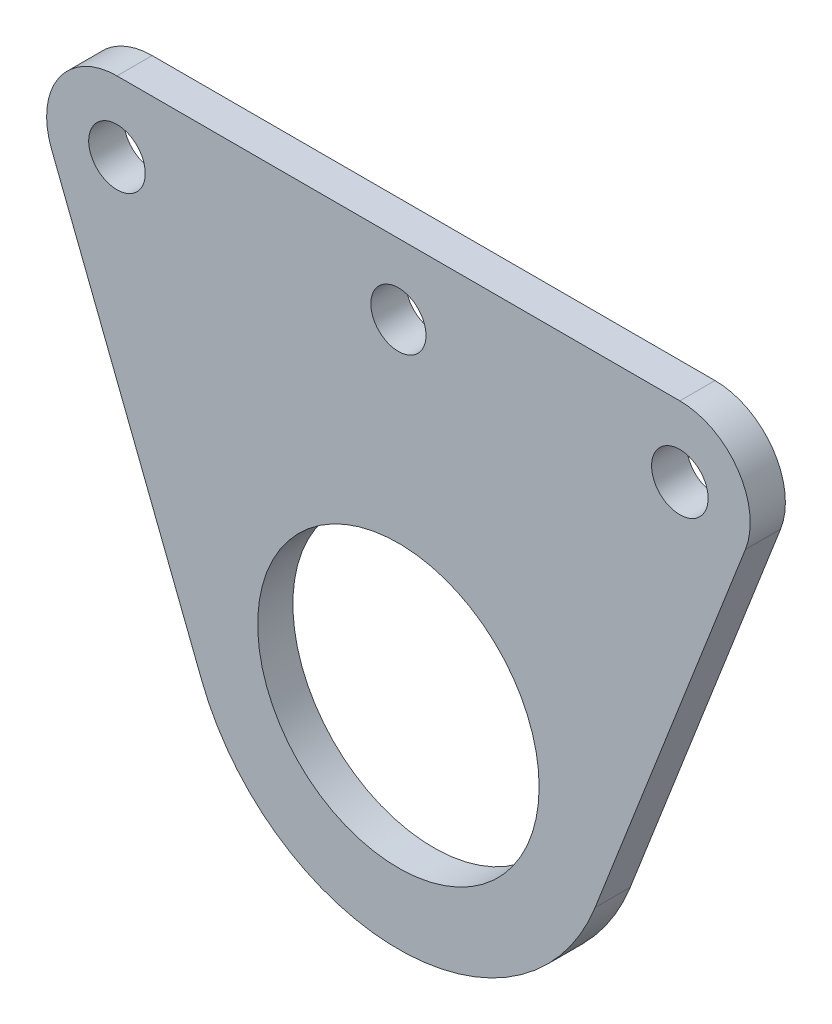
ISO-10303-21;
HEADER;
FILE_DESCRIPTION(('STEP AP214'),'2;1');
FILE_NAME('part.step','',(''),(''),'','','');
FILE_SCHEMA(('AUTOMOTIVE_DESIGN { 1 0 10303 214 1 1 1 1 }'));
ENDSEC;
DATA;
#1=APPLICATION_CONTEXT('core data for automotive mechanical design processes');
#2=APPLICATION_PROTOCOL_DEFINITION('international standard','automotive_design',2000,#1);
#3=PRODUCT_CONTEXT('',#1,'mechanical');
#4=PRODUCT('Part','Part','',(#3));
#5=PRODUCT_RELATED_PRODUCT_CATEGORY('part','',(#4));
#6=PRODUCT_DEFINITION_FORMATION('','',#4);
#7=PRODUCT_DEFINITION_CONTEXT('part definition',#1,'design');
#8=PRODUCT_DEFINITION('design','',#6,#7);
#9=PRODUCT_DEFINITION_SHAPE('','',#8);
#10=(LENGTH_UNIT() NAMED_UNIT(*) SI_UNIT(.MILLI.,.METRE.));
#11=(NAMED_UNIT(*) PLANE_ANGLE_UNIT() SI_UNIT($,.RADIAN.));
#12=(NAMED_UNIT(*) SI_UNIT($,.STERADIAN.) SOLID_ANGLE_UNIT());
#13=UNCERTAINTY_MEASURE_WITH_UNIT(LENGTH_MEASURE(1.E-05),#10,'distance_accuracy_value','');
#14=(GEOMETRIC_REPRESENTATION_CONTEXT(3) GLOBAL_UNCERTAINTY_ASSIGNED_CONTEXT((#13)) GLOBAL_UNIT_ASSIGNED_CONTEXT((#10,
#11,#12)) REPRESENTATION_CONTEXT('',''));
#15=CARTESIAN_POINT('',(0.,0.,0.));
#16=DIRECTION('',(0.,0.,1.));
#17=DIRECTION('',(1.,0.,0.));
#18=AXIS2_PLACEMENT_3D('',#15,#16,#17);
#19=CARTESIAN_POINT('',(38.1,336.55,127.));
#20=DIRECTION('',(0.,1.,0.));
#21=DIRECTION('',(0.,0.,1.));
#22=AXIS2_PLACEMENT_3D('',#19,#20,#21);
#23=PLANE('',#22);
#24=DIRECTION('',(1.,0.,0.));
#25=VECTOR('',#24,1.);
#26=CARTESIAN_POINT('',(38.1,336.55,123.825));
#27=LINE('',#26,#25);
#28=CARTESIAN_POINT('',(12.7,336.55,123.825));
#29=VERTEX_POINT('',#28);
#30=CARTESIAN_POINT('',(63.5,336.55,123.825));
#31=VERTEX_POINT('',#30);
#32=EDGE_CURVE('E122',#29,#31,#27,.T.);
#33=ORIENTED_EDGE('',*,*,#32,.F.);
#34=DIRECTION('',(0.,0.,-1.));
#35=VECTOR('',#34,1.);
#36=CARTESIAN_POINT('',(12.7,336.55,127.));
#37=LINE('',#36,#35);
#38=CARTESIAN_POINT('',(12.7,336.55,127.));
#39=VERTEX_POINT('',#38);
#40=EDGE_CURVE('E11',#39,#29,#37,.T.);
#41=ORIENTED_EDGE('',*,*,#40,.F.);
#42=DIRECTION('',(1.,0.,0.));
#43=VECTOR('',#42,1.);
#44=CARTESIAN_POINT('',(38.1,336.55,127.));
#45=LINE('',#44,#43);
#46=CARTESIAN_POINT('',(63.5,336.55,127.));
#47=VERTEX_POINT('',#46);
#48=EDGE_CURVE('E157',#39,#47,#45,.T.);
#49=ORIENTED_EDGE('',*,*,#48,.T.);
#50=DIRECTION('',(0.,0.,-1.));
#51=VECTOR('',#50,1.);
#52=CARTESIAN_POINT('',(63.5,336.55,127.));
#53=LINE('',#52,#51);
#54=EDGE_CURVE('E34',#47,#31,#53,.T.);
#55=ORIENTED_EDGE('',*,*,#54,.T.);
#56=EDGE_LOOP('',(#33,#41,#49,#55));
#57=FACE_BOUND('',#56,.T.);
#58=ADVANCED_FACE('F17',(#57),#23,.T.);
#59=CARTESIAN_POINT('',(12.7,330.2,127.));
#60=DIRECTION('',(0.,0.,-1.));
#61=DIRECTION('',(-1.,0.,0.));
#62=AXIS2_PLACEMENT_3D('',#59,#60,#61);
#63=CYLINDRICAL_SURFACE('',#62,6.34999999999979);
#64=CARTESIAN_POINT('',(12.7,330.2,123.825));
#65=DIRECTION('',(0.,0.,1.));
#66=DIRECTION('',(1.,0.,0.));
#67=AXIS2_PLACEMENT_3D('',#64,#65,#66);
#68=CIRCLE('',#67,6.34999999999979);
#69=CARTESIAN_POINT('',(6.78427939589271,327.892024754436,123.825));
#70=VERTEX_POINT('',#69);
#71=EDGE_CURVE('E125',#29,#70,#68,.T.);
#72=ORIENTED_EDGE('',*,*,#71,.T.);
#73=DIRECTION('',(0.,0.,-1.));
#74=VECTOR('',#73,1.);
#75=CARTESIAN_POINT('',(6.78427939589271,327.892024754436,127.));
#76=LINE('',#75,#74);
#77=CARTESIAN_POINT('',(6.78427939589271,327.892024754436,127.));
#78=VERTEX_POINT('',#77);
#79=EDGE_CURVE('E26',#78,#70,#76,.T.);
#80=ORIENTED_EDGE('',*,*,#79,.F.);
#81=CARTESIAN_POINT('',(12.7,330.2,127.));
#82=DIRECTION('',(0.,0.,1.));
#83=DIRECTION('',(1.,0.,0.));
#84=AXIS2_PLACEMENT_3D('',#81,#82,#83);
#85=CIRCLE('',#84,6.34999999999979);
#86=EDGE_CURVE('E289',#39,#78,#85,.T.);
#87=ORIENTED_EDGE('',*,*,#86,.F.);
#88=ORIENTED_EDGE('',*,*,#40,.T.);
#89=EDGE_LOOP('',(#72,#80,#87,#88));
#90=FACE_BOUND('',#89,.T.);
#91=ADVANCED_FACE('F189',(#90),#63,.T.);
#92=CARTESIAN_POINT('',(13.5685587917851,310.502799508871,127.));
#93=DIRECTION('',(0.931609543953947,0.36346066859279,0.));
#94=DIRECTION('',(-0.36346066859279,0.931609543953947,0.));
#95=AXIS2_PLACEMENT_3D('',#92,#93,#94);
#96=PLANE('',#95);
#97=DIRECTION('',(0.36346066859279,-0.931609543953947,0.));
#98=VECTOR('',#97,1.);
#99=CARTESIAN_POINT('',(13.5685587917851,310.502799508871,123.825));
#100=LINE('',#99,#98);
#101=CARTESIAN_POINT('',(20.3528381876774,293.113574263307,123.825));
#102=VERTEX_POINT('',#101);
#103=EDGE_CURVE('E128',#70,#102,#100,.T.);
#104=ORIENTED_EDGE('',*,*,#103,.T.);
#105=DIRECTION('',(0.,0.,-1.));
#106=VECTOR('',#105,1.);
#107=CARTESIAN_POINT('',(20.3528381876774,293.113574263307,127.));
#108=LINE('',#107,#106);
#109=CARTESIAN_POINT('',(20.3528381876774,293.113574263307,127.));
#110=VERTEX_POINT('',#109);
#111=EDGE_CURVE('E82',#110,#102,#108,.T.);
#112=ORIENTED_EDGE('',*,*,#111,.F.);
#113=DIRECTION('',(0.36346066859279,-0.931609543953947,0.));
#114=VECTOR('',#113,1.);
#115=CARTESIAN_POINT('',(13.5685587917851,310.502799508871,127.));
#116=LINE('',#115,#114);
#117=EDGE_CURVE('E92',#78,#110,#116,.T.);
#118=ORIENTED_EDGE('',*,*,#117,.F.);
#119=ORIENTED_EDGE('',*,*,#79,.T.);
#120=EDGE_LOOP('',(#104,#112,#118,#119));
#121=FACE_BOUND('',#120,.T.);
#122=ADVANCED_FACE('F167',(#121),#96,.F.);
#123=CARTESIAN_POINT('',(38.1,300.0375,127.));
#124=DIRECTION('',(0.,0.,-1.));
#125=DIRECTION('',(-1.,0.,0.));
#126=AXIS2_PLACEMENT_3D('',#123,#124,#125);
#127=CYLINDRICAL_SURFACE('',#126,19.05);
#128=CARTESIAN_POINT('',(38.1,300.0375,123.825));
#129=DIRECTION('',(0.,0.,-1.));
#130=DIRECTION('',(1.,0.,0.));
#131=AXIS2_PLACEMENT_3D('',#128,#129,#130);
#132=CIRCLE('',#131,19.05);
#133=CARTESIAN_POINT('',(55.8471618123228,293.113574263307,123.825));
#134=VERTEX_POINT('',#133);
#135=EDGE_CURVE('E77',#134,#102,#132,.T.);
#136=ORIENTED_EDGE('',*,*,#135,.F.);
#137=DIRECTION('',(0.,0.,-1.));
#138=VECTOR('',#137,1.);
#139=CARTESIAN_POINT('',(55.8471618123228,293.113574263307,127.));
#140=LINE('',#139,#138);
#141=CARTESIAN_POINT('',(55.8471618123228,293.113574263307,127.));
#142=VERTEX_POINT('',#141);
#143=EDGE_CURVE('E72',#142,#134,#140,.T.);
#144=ORIENTED_EDGE('',*,*,#143,.F.);
#145=CARTESIAN_POINT('',(38.1,300.0375,127.));
#146=DIRECTION('',(0.,0.,-1.));
#147=DIRECTION('',(1.,0.,0.));
#148=AXIS2_PLACEMENT_3D('',#145,#146,#147);
#149=CIRCLE('',#148,19.05);
#150=EDGE_CURVE('E75',#142,#110,#149,.T.);
#151=ORIENTED_EDGE('',*,*,#150,.T.);
#152=ORIENTED_EDGE('',*,*,#111,.T.);
#153=EDGE_LOOP('',(#136,#144,#151,#152));
#154=FACE_BOUND('',#153,.T.);
#155=ADVANCED_FACE('F74',(#154),#127,.T.);
#156=CARTESIAN_POINT('',(62.6314412082152,310.502799508871,127.));
#157=DIRECTION('',(0.931609543953947,-0.363460668592791,0.));
#158=DIRECTION('',(0.363460668592791,0.931609543953947,0.));
#159=AXIS2_PLACEMENT_3D('',#156,#157,#158);
#160=PLANE('',#159);
#161=DIRECTION('',(-0.363460668592791,-0.931609543953947,0.));
#162=VECTOR('',#161,1.);
#163=CARTESIAN_POINT('',(62.6314412082152,310.502799508871,123.825));
#164=LINE('',#163,#162);
#165=CARTESIAN_POINT('',(69.4157206041075,327.892024754436,123.825));
#166=VERTEX_POINT('',#165);
#167=EDGE_CURVE('E134',#166,#134,#164,.T.);
#168=ORIENTED_EDGE('',*,*,#167,.F.);
#169=DIRECTION('',(0.,0.,-1.));
#170=VECTOR('',#169,1.);
#171=CARTESIAN_POINT('',(69.4157206041075,327.892024754436,127.));
#172=LINE('',#171,#170);
#173=CARTESIAN_POINT('',(69.4157206041075,327.892024754436,127.));
#174=VERTEX_POINT('',#173);
#175=EDGE_CURVE('E53',#174,#166,#172,.T.);
#176=ORIENTED_EDGE('',*,*,#175,.F.);
#177=DIRECTION('',(-0.363460668592791,-0.931609543953947,0.));
#178=VECTOR('',#177,1.);
#179=CARTESIAN_POINT('',(62.6314412082152,310.502799508871,127.));
#180=LINE('',#179,#178);
#181=EDGE_CURVE('E90',#174,#142,#180,.T.);
#182=ORIENTED_EDGE('',*,*,#181,.T.);
#183=ORIENTED_EDGE('',*,*,#143,.T.);
#184=EDGE_LOOP('',(#168,#176,#182,#183));
#185=FACE_BOUND('',#184,.T.);
#186=ADVANCED_FACE('F96',(#185),#160,.T.);
#187=CARTESIAN_POINT('',(38.1,330.2,127.));
#188=DIRECTION('',(0.,0.,-1.));
#189=DIRECTION('',(-1.,0.,0.));
#190=AXIS2_PLACEMENT_3D('',#187,#188,#189);
#191=CYLINDRICAL_SURFACE('',#190,2.4892);
#192=CARTESIAN_POINT('',(38.1,330.2,127.));
#193=DIRECTION('',(0.,0.,1.));
#194=DIRECTION('',(1.,0.,0.));
#195=AXIS2_PLACEMENT_3D('',#192,#193,#194);
#196=CIRCLE('',#195,2.4892);
#197=CARTESIAN_POINT('',(40.5892,330.2,127.));
#198=VERTEX_POINT('',#197);
#199=EDGE_CURVE('E114',#198,#198,#196,.T.);
#200=ORIENTED_EDGE('',*,*,#199,.T.);
#201=EDGE_LOOP('',(#200));
#202=FACE_BOUND('',#201,.T.);
#203=CARTESIAN_POINT('',(38.1,330.2,123.825));
#204=DIRECTION('',(0.,0.,1.));
#205=DIRECTION('',(1.,0.,0.));
#206=AXIS2_PLACEMENT_3D('',#203,#204,#205);
#207=CIRCLE('',#206,2.4892);
#208=CARTESIAN_POINT('',(40.5892,330.2,123.825));
#209=VERTEX_POINT('',#208);
#210=EDGE_CURVE('E149',#209,#209,#207,.T.);
#211=ORIENTED_EDGE('',*,*,#210,.F.);
#212=EDGE_LOOP('',(#211));
#213=FACE_BOUND('',#212,.T.);
#214=ADVANCED_FACE('F198',(#202,#213),#191,.F.);
#215=CARTESIAN_POINT('',(63.5,330.2,127.));
#216=DIRECTION('',(0.,0.,-1.));
#217=DIRECTION('',(-1.,0.,0.));
#218=AXIS2_PLACEMENT_3D('',#215,#216,#217);
#219=CYLINDRICAL_SURFACE('',#218,2.5527);
#220=CARTESIAN_POINT('',(63.5,330.2,127.));
#221=DIRECTION('',(0.,0.,1.));
#222=DIRECTION('',(1.,0.,0.));
#223=AXIS2_PLACEMENT_3D('',#220,#221,#222);
#224=CIRCLE('',#223,2.5527);
#225=CARTESIAN_POINT('',(66.0527,330.2,127.));
#226=VERTEX_POINT('',#225);
#227=EDGE_CURVE('E110',#226,#226,#224,.T.);
#228=ORIENTED_EDGE('',*,*,#227,.T.);
#229=EDGE_LOOP('',(#228));
#230=FACE_BOUND('',#229,.T.);
#231=CARTESIAN_POINT('',(63.5,330.2,123.825));
#232=DIRECTION('',(0.,0.,1.));
#233=DIRECTION('',(1.,0.,0.));
#234=AXIS2_PLACEMENT_3D('',#231,#232,#233);
#235=CIRCLE('',#234,2.5527);
#236=CARTESIAN_POINT('',(66.0527,330.2,123.825));
#237=VERTEX_POINT('',#236);
#238=EDGE_CURVE('E145',#237,#237,#235,.T.);
#239=ORIENTED_EDGE('',*,*,#238,.F.);
#240=EDGE_LOOP('',(#239));
#241=FACE_BOUND('',#240,.T.);
#242=ADVANCED_FACE('F184',(#230,#241),#219,.F.);
#243=CARTESIAN_POINT('',(38.1,300.0375,127.));
#244=DIRECTION('',(0.,0.,-1.));
#245=DIRECTION('',(-1.,0.,0.));
#246=AXIS2_PLACEMENT_3D('',#243,#244,#245);
#247=CYLINDRICAL_SURFACE('',#246,12.7);
#248=CARTESIAN_POINT('',(38.1,300.0375,127.));
#249=DIRECTION('',(0.,0.,1.));
#250=DIRECTION('',(1.,0.,0.));
#251=AXIS2_PLACEMENT_3D('',#248,#249,#250);
#252=CIRCLE('',#251,12.7);
#253=CARTESIAN_POINT('',(50.8,300.0375,127.));
#254=VERTEX_POINT('',#253);
#255=EDGE_CURVE('E104',#254,#254,#252,.T.);
#256=ORIENTED_EDGE('',*,*,#255,.T.);
#257=EDGE_LOOP('',(#256));
#258=FACE_BOUND('',#257,.T.);
#259=CARTESIAN_POINT('',(38.1,300.0375,123.825));
#260=DIRECTION('',(0.,0.,1.));
#261=DIRECTION('',(1.,0.,0.));
#262=AXIS2_PLACEMENT_3D('',#259,#260,#261);
#263=CIRCLE('',#262,12.7);
#264=CARTESIAN_POINT('',(50.8,300.0375,123.825));
#265=VERTEX_POINT('',#264);
#266=EDGE_CURVE('E141',#265,#265,#263,.T.);
#267=ORIENTED_EDGE('',*,*,#266,.F.);
#268=EDGE_LOOP('',(#267));
#269=FACE_BOUND('',#268,.T.);
#270=ADVANCED_FACE('F176',(#258,#269),#247,.F.);
#271=CARTESIAN_POINT('',(63.5,330.2,127.));
#272=DIRECTION('',(0.,0.,-1.));
#273=DIRECTION('',(-1.,0.,0.));
#274=AXIS2_PLACEMENT_3D('',#271,#272,#273);
#275=CYLINDRICAL_SURFACE('',#274,6.34999999999983);
#276=CARTESIAN_POINT('',(63.5,330.2,123.825));
#277=DIRECTION('',(0.,0.,-1.));
#278=DIRECTION('',(1.,0.,0.));
#279=AXIS2_PLACEMENT_3D('',#276,#277,#278);
#280=CIRCLE('',#279,6.34999999999983);
#281=EDGE_CURVE('E137',#31,#166,#280,.T.);
#282=ORIENTED_EDGE('',*,*,#281,.F.);
#283=ORIENTED_EDGE('',*,*,#54,.F.);
#284=CARTESIAN_POINT('',(63.5,330.2,127.));
#285=DIRECTION('',(0.,0.,-1.));
#286=DIRECTION('',(1.,0.,0.));
#287=AXIS2_PLACEMENT_3D('',#284,#285,#286);
#288=CIRCLE('',#287,6.34999999999983);
#289=EDGE_CURVE('E98',#47,#174,#288,.T.);
#290=ORIENTED_EDGE('',*,*,#289,.T.);
#291=ORIENTED_EDGE('',*,*,#175,.T.);
#292=EDGE_LOOP('',(#282,#283,#290,#291));
#293=FACE_BOUND('',#292,.T.);
#294=ADVANCED_FACE('F173',(#293),#275,.T.);
#295=CARTESIAN_POINT('',(12.7000000000002,330.2,127.));
#296=DIRECTION('',(0.,0.,-1.));
#297=DIRECTION('',(-1.,0.,0.));
#298=AXIS2_PLACEMENT_3D('',#295,#296,#297);
#299=CYLINDRICAL_SURFACE('',#298,2.5527);
#300=CARTESIAN_POINT('',(12.7000000000002,330.2,127.));
#301=DIRECTION('',(0.,0.,1.));
#302=DIRECTION('',(1.,0.,0.));
#303=AXIS2_PLACEMENT_3D('',#300,#301,#302);
#304=CIRCLE('',#303,2.5527);
#305=CARTESIAN_POINT('',(15.2527000000002,330.2,127.));
#306=VERTEX_POINT('',#305);
#307=EDGE_CURVE('E118',#306,#306,#304,.T.);
#308=ORIENTED_EDGE('',*,*,#307,.T.);
#309=EDGE_LOOP('',(#308));
#310=FACE_BOUND('',#309,.T.);
#311=CARTESIAN_POINT('',(12.7000000000002,330.2,123.825));
#312=DIRECTION('',(0.,0.,1.));
#313=DIRECTION('',(1.,0.,0.));
#314=AXIS2_PLACEMENT_3D('',#311,#312,#313);
#315=CIRCLE('',#314,2.5527);
#316=CARTESIAN_POINT('',(15.2527000000002,330.2,123.825));
#317=VERTEX_POINT('',#316);
#318=EDGE_CURVE('E153',#317,#317,#315,.T.);
#319=ORIENTED_EDGE('',*,*,#318,.F.);
#320=EDGE_LOOP('',(#319));
#321=FACE_BOUND('',#320,.T.);
#322=ADVANCED_FACE('F175',(#310,#321),#299,.F.);
#323=CARTESIAN_POINT('',(0.,107.95,127.));
#324=DIRECTION('',(0.,0.,1.));
#325=DIRECTION('',(1.,0.,0.));
#326=AXIS2_PLACEMENT_3D('',#323,#324,#325);
#327=PLANE('',#326);
#328=ORIENTED_EDGE('',*,*,#48,.F.);
#329=ORIENTED_EDGE('',*,*,#86,.T.);
#330=ORIENTED_EDGE('',*,*,#117,.T.);
#331=ORIENTED_EDGE('',*,*,#150,.F.);
#332=ORIENTED_EDGE('',*,*,#181,.F.);
#333=ORIENTED_EDGE('',*,*,#289,.F.);
#334=EDGE_LOOP('',(#328,#329,#330,#331,#332,#333));
#335=FACE_BOUND('',#334,.T.);
#336=ORIENTED_EDGE('',*,*,#255,.F.);
#337=EDGE_LOOP('',(#336));
#338=FACE_BOUND('',#337,.T.);
#339=ORIENTED_EDGE('',*,*,#227,.F.);
#340=EDGE_LOOP('',(#339));
#341=FACE_BOUND('',#340,.T.);
#342=ORIENTED_EDGE('',*,*,#199,.F.);
#343=EDGE_LOOP('',(#342));
#344=FACE_BOUND('',#343,.T.);
#345=ORIENTED_EDGE('',*,*,#307,.F.);
#346=EDGE_LOOP('',(#345));
#347=FACE_BOUND('',#346,.T.);
#348=ADVANCED_FACE('F87',(#335,#338,#341,#344,#347),#327,.T.);
#349=CARTESIAN_POINT('',(0.,107.95,123.825));
#350=DIRECTION('',(0.,0.,1.));
#351=DIRECTION('',(1.,0.,0.));
#352=AXIS2_PLACEMENT_3D('',#349,#350,#351);
#353=PLANE('',#352);
#354=ORIENTED_EDGE('',*,*,#32,.T.);
#355=ORIENTED_EDGE('',*,*,#281,.T.);
#356=ORIENTED_EDGE('',*,*,#167,.T.);
#357=ORIENTED_EDGE('',*,*,#135,.T.);
#358=ORIENTED_EDGE('',*,*,#103,.F.);
#359=ORIENTED_EDGE('',*,*,#71,.F.);
#360=EDGE_LOOP('',(#354,#355,#356,#357,#358,#359));
#361=FACE_BOUND('',#360,.T.);
#362=ORIENTED_EDGE('',*,*,#266,.T.);
#363=EDGE_LOOP('',(#362));
#364=FACE_BOUND('',#363,.T.);
#365=ORIENTED_EDGE('',*,*,#238,.T.);
#366=EDGE_LOOP('',(#365));
#367=FACE_BOUND('',#366,.T.);
#368=ORIENTED_EDGE('',*,*,#210,.T.);
#369=EDGE_LOOP('',(#368));
#370=FACE_BOUND('',#369,.T.);
#371=ORIENTED_EDGE('',*,*,#318,.T.);
#372=EDGE_LOOP('',(#371));
#373=FACE_BOUND('',#372,.T.);
#374=ADVANCED_FACE('F171',(#361,#364,#367,#370,#373),#353,.F.);
#375=CLOSED_SHELL('',(#58,#91,#122,#155,#186,#214,#242,#270,#294,#322,#348,#374));
#376=MANIFOLD_SOLID_BREP('B1',#375);
#377=ADVANCED_BREP_SHAPE_REPRESENTATION('',(#18,#376),#14);
#378=SHAPE_DEFINITION_REPRESENTATION(#9,#377);
ENDSEC;
END-ISO-10303-21;
